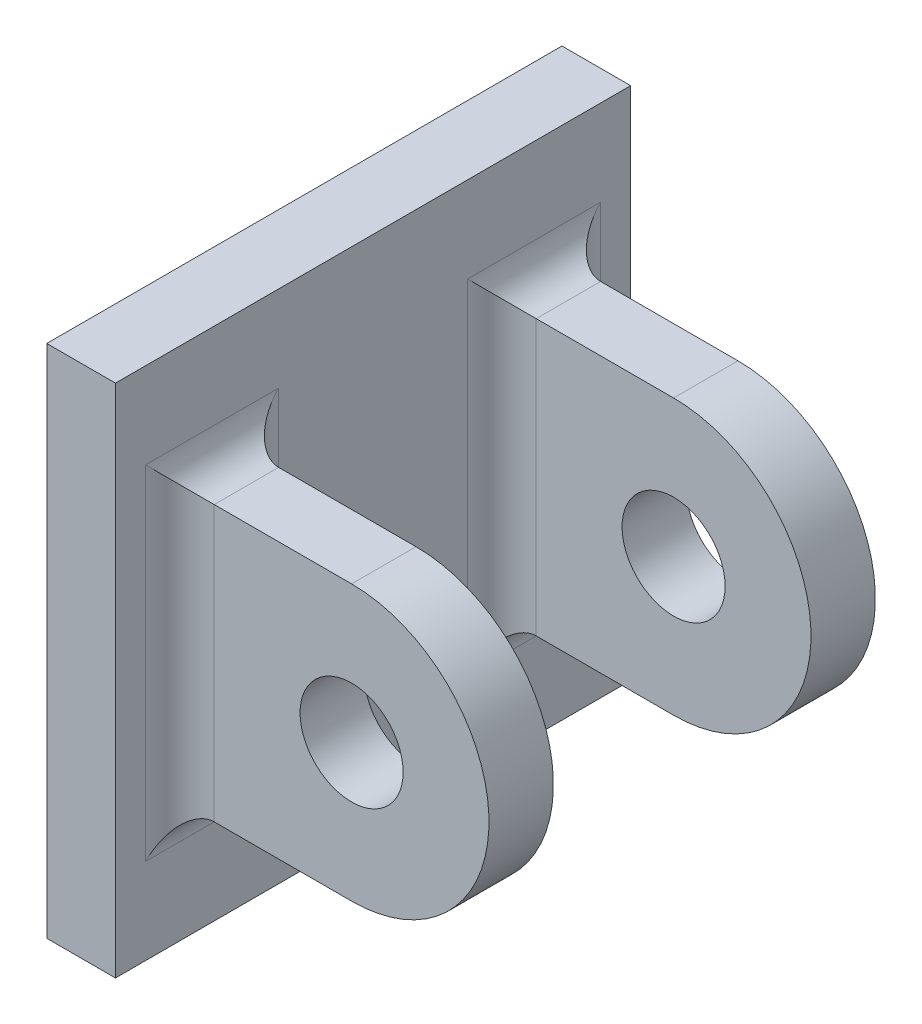
ISO-10303-21;
HEADER;
FILE_DESCRIPTION(('STEP AP214'),'2;1');
FILE_NAME('part.step','',(''),(''),'','','');
FILE_SCHEMA(('AUTOMOTIVE_DESIGN { 1 0 10303 214 1 1 1 1 }'));
ENDSEC;
DATA;
#1=APPLICATION_CONTEXT('core data for automotive mechanical design processes');
#2=APPLICATION_PROTOCOL_DEFINITION('international standard','automotive_design',2000,#1);
#3=PRODUCT_CONTEXT('',#1,'mechanical');
#4=PRODUCT('Part','Part','',(#3));
#5=PRODUCT_RELATED_PRODUCT_CATEGORY('part','',(#4));
#6=PRODUCT_DEFINITION_FORMATION('','',#4);
#7=PRODUCT_DEFINITION_CONTEXT('part definition',#1,'design');
#8=PRODUCT_DEFINITION('design','',#6,#7);
#9=PRODUCT_DEFINITION_SHAPE('','',#8);
#10=(LENGTH_UNIT() NAMED_UNIT(*) SI_UNIT(.MILLI.,.METRE.));
#11=(NAMED_UNIT(*) PLANE_ANGLE_UNIT() SI_UNIT($,.RADIAN.));
#12=(NAMED_UNIT(*) SI_UNIT($,.STERADIAN.) SOLID_ANGLE_UNIT());
#13=UNCERTAINTY_MEASURE_WITH_UNIT(LENGTH_MEASURE(1.E-05),#10,'distance_accuracy_value','');
#14=(GEOMETRIC_REPRESENTATION_CONTEXT(3) GLOBAL_UNCERTAINTY_ASSIGNED_CONTEXT((#13)) GLOBAL_UNIT_ASSIGNED_CONTEXT((#10,
#11,#12)) REPRESENTATION_CONTEXT('',''));
#15=CARTESIAN_POINT('',(0.,0.,0.));
#16=DIRECTION('',(0.,0.,1.));
#17=DIRECTION('',(1.,0.,0.));
#18=AXIS2_PLACEMENT_3D('',#15,#16,#17);
#19=CARTESIAN_POINT('',(13.97,14.605,-2.38125));
#20=DIRECTION('',(0.,0.,-1.));
#21=DIRECTION('',(-1.,0.,0.));
#22=AXIS2_PLACEMENT_3D('',#19,#20,#21);
#23=PLANE('',#22);
#24=CARTESIAN_POINT('',(8.89,9.525,-2.38125));
#25=DIRECTION('',(0.,0.,1.));
#26=DIRECTION('',(1.,0.,0.));
#27=AXIS2_PLACEMENT_3D('',#24,#25,#26);
#28=CIRCLE('',#27,1.905);
#29=CARTESIAN_POINT('',(10.795,9.525,-2.38125));
#30=VERTEX_POINT('',#29);
#31=EDGE_CURVE('E218',#30,#30,#28,.T.);
#32=ORIENTED_EDGE('',*,*,#31,.F.);
#33=EDGE_LOOP('',(#32));
#34=FACE_BOUND('',#33,.T.);
#35=DIRECTION('',(-1.,0.,0.));
#36=VECTOR('',#35,1.);
#37=CARTESIAN_POINT('',(13.97,14.605,-2.38125));
#38=LINE('',#37,#36);
#39=CARTESIAN_POINT('',(8.89,14.605,-2.38125));
#40=VERTEX_POINT('',#39);
#41=CARTESIAN_POINT('',(3.81,14.605,-2.38125));
#42=VERTEX_POINT('',#41);
#43=EDGE_CURVE('E290',#40,#42,#38,.T.);
#44=ORIENTED_EDGE('',*,*,#43,.T.);
#45=DIRECTION('',(0.,-1.,0.));
#46=VECTOR('',#45,1.);
#47=CARTESIAN_POINT('',(3.81,4.445,-2.38125));
#48=LINE('',#47,#46);
#49=CARTESIAN_POINT('',(3.81,4.445,-2.38125));
#50=VERTEX_POINT('',#49);
#51=EDGE_CURVE('E53',#42,#50,#48,.T.);
#52=ORIENTED_EDGE('',*,*,#51,.T.);
#53=DIRECTION('',(-1.,0.,0.));
#54=VECTOR('',#53,1.);
#55=CARTESIAN_POINT('',(13.97,4.445,-2.38125));
#56=LINE('',#55,#54);
#57=CARTESIAN_POINT('',(8.89,4.445,-2.38125));
#58=VERTEX_POINT('',#57);
#59=EDGE_CURVE('E169',#58,#50,#56,.T.);
#60=ORIENTED_EDGE('',*,*,#59,.F.);
#61=CARTESIAN_POINT('',(8.89,9.525,-2.38125));
#62=DIRECTION('',(0.,0.,1.));
#63=DIRECTION('',(1.,0.,0.));
#64=AXIS2_PLACEMENT_3D('',#61,#62,#63);
#65=CIRCLE('',#64,5.08);
#66=EDGE_CURVE('E159',#58,#40,#65,.T.);
#67=ORIENTED_EDGE('',*,*,#66,.T.);
#68=EDGE_LOOP('',(#44,#52,#60,#67));
#69=FACE_BOUND('',#68,.T.);
#70=ADVANCED_FACE('F44',(#34,#69),#23,.F.);
#71=CARTESIAN_POINT('',(13.97,14.605,-4.7625));
#72=DIRECTION('',(0.,0.,1.));
#73=DIRECTION('',(0.,-1.,0.));
#74=AXIS2_PLACEMENT_3D('',#71,#72,#73);
#75=PLANE('',#74);
#76=CARTESIAN_POINT('',(8.89,9.525,-4.7625));
#77=DIRECTION('',(0.,0.,1.));
#78=DIRECTION('',(0.,-1.,0.));
#79=AXIS2_PLACEMENT_3D('',#76,#77,#78);
#80=CIRCLE('',#79,1.905);
#81=CARTESIAN_POINT('',(8.89,7.62,-4.7625));
#82=VERTEX_POINT('',#81);
#83=EDGE_CURVE('E173',#82,#82,#80,.T.);
#84=ORIENTED_EDGE('',*,*,#83,.T.);
#85=EDGE_LOOP('',(#84));
#86=FACE_BOUND('',#85,.T.);
#87=DIRECTION('',(-1.,0.,0.));
#88=VECTOR('',#87,1.);
#89=CARTESIAN_POINT('',(13.97,4.445,-4.7625));
#90=LINE('',#89,#88);
#91=CARTESIAN_POINT('',(8.89,4.445,-4.7625));
#92=VERTEX_POINT('',#91);
#93=CARTESIAN_POINT('',(3.81,4.445,-4.7625));
#94=VERTEX_POINT('',#93);
#95=EDGE_CURVE('E172',#92,#94,#90,.T.);
#96=ORIENTED_EDGE('',*,*,#95,.T.);
#97=DIRECTION('',(0.,1.,0.));
#98=VECTOR('',#97,1.);
#99=CARTESIAN_POINT('',(3.81,14.605,-4.7625));
#100=LINE('',#99,#98);
#101=CARTESIAN_POINT('',(3.81,14.605,-4.7625));
#102=VERTEX_POINT('',#101);
#103=EDGE_CURVE('E245',#94,#102,#100,.T.);
#104=ORIENTED_EDGE('',*,*,#103,.T.);
#105=DIRECTION('',(-1.,0.,0.));
#106=VECTOR('',#105,1.);
#107=CARTESIAN_POINT('',(13.97,14.605,-4.7625));
#108=LINE('',#107,#106);
#109=CARTESIAN_POINT('',(8.89,14.605,-4.7625));
#110=VERTEX_POINT('',#109);
#111=EDGE_CURVE('E180',#110,#102,#108,.T.);
#112=ORIENTED_EDGE('',*,*,#111,.F.);
#113=CARTESIAN_POINT('',(8.89,9.525,-4.7625));
#114=DIRECTION('',(0.,0.,1.));
#115=DIRECTION('',(0.,-1.,0.));
#116=AXIS2_PLACEMENT_3D('',#113,#114,#115);
#117=CIRCLE('',#116,5.08);
#118=EDGE_CURVE('E305',#92,#110,#117,.T.);
#119=ORIENTED_EDGE('',*,*,#118,.F.);
#120=EDGE_LOOP('',(#96,#104,#112,#119));
#121=FACE_BOUND('',#120,.T.);
#122=ADVANCED_FACE('F288',(#86,#121),#75,.F.);
#123=CARTESIAN_POINT('',(13.97,14.605,-14.2875));
#124=DIRECTION('',(0.,0.,-1.));
#125=DIRECTION('',(0.,1.,0.));
#126=AXIS2_PLACEMENT_3D('',#123,#124,#125);
#127=PLANE('',#126);
#128=CARTESIAN_POINT('',(8.89,9.525,-14.2875));
#129=DIRECTION('',(0.,0.,-1.));
#130=DIRECTION('',(0.,1.,0.));
#131=AXIS2_PLACEMENT_3D('',#128,#129,#130);
#132=CIRCLE('',#131,1.905);
#133=CARTESIAN_POINT('',(8.89,11.43,-14.2875));
#134=VERTEX_POINT('',#133);
#135=EDGE_CURVE('E217',#134,#134,#132,.T.);
#136=ORIENTED_EDGE('',*,*,#135,.T.);
#137=EDGE_LOOP('',(#136));
#138=FACE_BOUND('',#137,.T.);
#139=DIRECTION('',(-1.,0.,0.));
#140=VECTOR('',#139,1.);
#141=CARTESIAN_POINT('',(13.97,14.605,-14.2875));
#142=LINE('',#141,#140);
#143=CARTESIAN_POINT('',(8.89,14.605,-14.2875));
#144=VERTEX_POINT('',#143);
#145=CARTESIAN_POINT('',(3.81,14.605,-14.2875));
#146=VERTEX_POINT('',#145);
#147=EDGE_CURVE('E302',#144,#146,#142,.T.);
#148=ORIENTED_EDGE('',*,*,#147,.T.);
#149=DIRECTION('',(0.,-1.,0.));
#150=VECTOR('',#149,1.);
#151=CARTESIAN_POINT('',(3.81,4.445,-14.2875));
#152=LINE('',#151,#150);
#153=CARTESIAN_POINT('',(3.81,4.445,-14.2875));
#154=VERTEX_POINT('',#153);
#155=EDGE_CURVE('E213',#146,#154,#152,.T.);
#156=ORIENTED_EDGE('',*,*,#155,.T.);
#157=DIRECTION('',(-1.,0.,0.));
#158=VECTOR('',#157,1.);
#159=CARTESIAN_POINT('',(13.97,4.445,-14.2875));
#160=LINE('',#159,#158);
#161=CARTESIAN_POINT('',(8.89,4.445,-14.2875));
#162=VERTEX_POINT('',#161);
#163=EDGE_CURVE('E291',#162,#154,#160,.T.);
#164=ORIENTED_EDGE('',*,*,#163,.F.);
#165=CARTESIAN_POINT('',(8.89,9.525,-14.2875));
#166=DIRECTION('',(0.,0.,-1.));
#167=DIRECTION('',(0.,1.,0.));
#168=AXIS2_PLACEMENT_3D('',#165,#166,#167);
#169=CIRCLE('',#168,5.08);
#170=EDGE_CURVE('E307',#144,#162,#169,.T.);
#171=ORIENTED_EDGE('',*,*,#170,.F.);
#172=EDGE_LOOP('',(#148,#156,#164,#171));
#173=FACE_BOUND('',#172,.T.);
#174=ADVANCED_FACE('F328',(#138,#173),#127,.F.);
#175=CARTESIAN_POINT('',(13.97,14.605,-16.66875));
#176=DIRECTION('',(0.,0.,1.));
#177=DIRECTION('',(1.,0.,0.));
#178=AXIS2_PLACEMENT_3D('',#175,#176,#177);
#179=PLANE('',#178);
#180=CARTESIAN_POINT('',(8.89,9.525,-16.66875));
#181=DIRECTION('',(0.,0.,1.));
#182=DIRECTION('',(1.,0.,0.));
#183=AXIS2_PLACEMENT_3D('',#180,#181,#182);
#184=CIRCLE('',#183,1.905);
#185=CARTESIAN_POINT('',(10.795,9.525,-16.66875));
#186=VERTEX_POINT('',#185);
#187=EDGE_CURVE('E214',#186,#186,#184,.T.);
#188=ORIENTED_EDGE('',*,*,#187,.T.);
#189=EDGE_LOOP('',(#188));
#190=FACE_BOUND('',#189,.T.);
#191=DIRECTION('',(-1.,0.,0.));
#192=VECTOR('',#191,1.);
#193=CARTESIAN_POINT('',(13.97,4.445,-16.66875));
#194=LINE('',#193,#192);
#195=CARTESIAN_POINT('',(8.89,4.445,-16.66875));
#196=VERTEX_POINT('',#195);
#197=CARTESIAN_POINT('',(3.81,4.445,-16.66875));
#198=VERTEX_POINT('',#197);
#199=EDGE_CURVE('E296',#196,#198,#194,.T.);
#200=ORIENTED_EDGE('',*,*,#199,.T.);
#201=DIRECTION('',(0.,1.,0.));
#202=VECTOR('',#201,1.);
#203=CARTESIAN_POINT('',(3.81,14.605,-16.66875));
#204=LINE('',#203,#202);
#205=CARTESIAN_POINT('',(3.81,14.605,-16.66875));
#206=VERTEX_POINT('',#205);
#207=EDGE_CURVE('E243',#198,#206,#204,.T.);
#208=ORIENTED_EDGE('',*,*,#207,.T.);
#209=DIRECTION('',(-1.,0.,0.));
#210=VECTOR('',#209,1.);
#211=CARTESIAN_POINT('',(13.97,14.605,-16.66875));
#212=LINE('',#211,#210);
#213=CARTESIAN_POINT('',(8.89,14.605,-16.66875));
#214=VERTEX_POINT('',#213);
#215=EDGE_CURVE('E299',#214,#206,#212,.T.);
#216=ORIENTED_EDGE('',*,*,#215,.F.);
#217=CARTESIAN_POINT('',(8.89,9.525,-16.66875));
#218=DIRECTION('',(0.,0.,1.));
#219=DIRECTION('',(1.,0.,0.));
#220=AXIS2_PLACEMENT_3D('',#217,#218,#219);
#221=CIRCLE('',#220,5.08);
#222=EDGE_CURVE('E309',#196,#214,#221,.T.);
#223=ORIENTED_EDGE('',*,*,#222,.F.);
#224=EDGE_LOOP('',(#200,#208,#216,#223));
#225=FACE_BOUND('',#224,.T.);
#226=ADVANCED_FACE('F474',(#190,#225),#179,.F.);
#227=CARTESIAN_POINT('',(13.97,14.605,-2.38125));
#228=DIRECTION('',(0.,-1.,0.));
#229=DIRECTION('',(0.,0.,-1.));
#230=AXIS2_PLACEMENT_3D('',#227,#228,#229);
#231=PLANE('',#230);
#232=ORIENTED_EDGE('',*,*,#111,.T.);
#233=DIRECTION('',(0.,0.,1.));
#234=VECTOR('',#233,1.);
#235=CARTESIAN_POINT('',(3.81,14.605,-2.38125));
#236=LINE('',#235,#234);
#237=EDGE_CURVE('E13',#102,#42,#236,.T.);
#238=ORIENTED_EDGE('',*,*,#237,.T.);
#239=ORIENTED_EDGE('',*,*,#43,.F.);
#240=DIRECTION('',(0.,0.,1.));
#241=VECTOR('',#240,1.);
#242=CARTESIAN_POINT('',(8.89,14.605,-19.05));
#243=LINE('',#242,#241);
#244=EDGE_CURVE('E165',#110,#40,#243,.T.);
#245=ORIENTED_EDGE('',*,*,#244,.F.);
#246=EDGE_LOOP('',(#232,#238,#239,#245));
#247=FACE_BOUND('',#246,.T.);
#248=ADVANCED_FACE('F289',(#247),#231,.F.);
#249=CARTESIAN_POINT('',(13.97,14.605,-14.2875));
#250=DIRECTION('',(0.,-1.,0.));
#251=DIRECTION('',(0.,0.,-1.));
#252=AXIS2_PLACEMENT_3D('',#249,#250,#251);
#253=PLANE('',#252);
#254=ORIENTED_EDGE('',*,*,#215,.T.);
#255=DIRECTION('',(0.,0.,1.));
#256=VECTOR('',#255,1.);
#257=CARTESIAN_POINT('',(3.81,14.605,-14.2875));
#258=LINE('',#257,#256);
#259=EDGE_CURVE('E239',#206,#146,#258,.T.);
#260=ORIENTED_EDGE('',*,*,#259,.T.);
#261=ORIENTED_EDGE('',*,*,#147,.F.);
#262=EDGE_CURVE('E311',#214,#144,#243,.T.);
#263=ORIENTED_EDGE('',*,*,#262,.F.);
#264=EDGE_LOOP('',(#254,#260,#261,#263));
#265=FACE_BOUND('',#264,.T.);
#266=ADVANCED_FACE('F336',(#265),#253,.F.);
#267=CARTESIAN_POINT('',(2.54,0.,0.));
#268=DIRECTION('',(-1.,0.,0.));
#269=DIRECTION('',(0.,0.,1.));
#270=AXIS2_PLACEMENT_3D('',#267,#268,#269);
#271=PLANE('',#270);
#272=DIRECTION('',(0.,0.,-1.));
#273=VECTOR('',#272,1.);
#274=CARTESIAN_POINT('',(2.54,3.175,-14.2875));
#275=LINE('',#274,#273);
#276=CARTESIAN_POINT('',(2.54,3.175,-17.93875));
#277=VERTEX_POINT('',#276);
#278=CARTESIAN_POINT('',(2.54,3.175,-13.0175));
#279=VERTEX_POINT('',#278);
#280=EDGE_CURVE('E232',#277,#279,#275,.F.);
#281=ORIENTED_EDGE('',*,*,#280,.T.);
#282=DIRECTION('',(0.,-1.,0.));
#283=VECTOR('',#282,1.);
#284=CARTESIAN_POINT('',(2.54,14.605,-13.0175));
#285=LINE('',#284,#283);
#286=CARTESIAN_POINT('',(2.54,15.875,-13.0175));
#287=VERTEX_POINT('',#286);
#288=EDGE_CURVE('E236',#279,#287,#285,.F.);
#289=ORIENTED_EDGE('',*,*,#288,.T.);
#290=DIRECTION('',(0.,0.,1.));
#291=VECTOR('',#290,1.);
#292=CARTESIAN_POINT('',(2.54,15.875,-16.66875));
#293=LINE('',#292,#291);
#294=CARTESIAN_POINT('',(2.54,15.875,-17.93875));
#295=VERTEX_POINT('',#294);
#296=EDGE_CURVE('E234',#287,#295,#293,.F.);
#297=ORIENTED_EDGE('',*,*,#296,.T.);
#298=DIRECTION('',(0.,1.,0.));
#299=VECTOR('',#298,1.);
#300=CARTESIAN_POINT('',(2.54,4.445,-17.93875));
#301=LINE('',#300,#299);
#302=EDGE_CURVE('E230',#295,#277,#301,.F.);
#303=ORIENTED_EDGE('',*,*,#302,.T.);
#304=EDGE_LOOP('',(#281,#289,#297,#303));
#305=FACE_BOUND('',#304,.T.);
#306=DIRECTION('',(0.,0.,1.));
#307=VECTOR('',#306,1.);
#308=CARTESIAN_POINT('',(2.54,15.875,-4.7625));
#309=LINE('',#308,#307);
#310=CARTESIAN_POINT('',(2.54,15.875,-1.11125));
#311=VERTEX_POINT('',#310);
#312=CARTESIAN_POINT('',(2.54,15.875,-6.0325));
#313=VERTEX_POINT('',#312);
#314=EDGE_CURVE('E221',#311,#313,#309,.F.);
#315=ORIENTED_EDGE('',*,*,#314,.T.);
#316=DIRECTION('',(0.,1.,0.));
#317=VECTOR('',#316,1.);
#318=CARTESIAN_POINT('',(2.54,4.445,-6.0325));
#319=LINE('',#318,#317);
#320=CARTESIAN_POINT('',(2.54,3.175,-6.0325));
#321=VERTEX_POINT('',#320);
#322=EDGE_CURVE('E227',#313,#321,#319,.F.);
#323=ORIENTED_EDGE('',*,*,#322,.T.);
#324=DIRECTION('',(0.,0.,-1.));
#325=VECTOR('',#324,1.);
#326=CARTESIAN_POINT('',(2.54,3.175,-2.38125));
#327=LINE('',#326,#325);
#328=CARTESIAN_POINT('',(2.54,3.175,-1.11125));
#329=VERTEX_POINT('',#328);
#330=EDGE_CURVE('E225',#321,#329,#327,.F.);
#331=ORIENTED_EDGE('',*,*,#330,.T.);
#332=DIRECTION('',(0.,-1.,0.));
#333=VECTOR('',#332,1.);
#334=CARTESIAN_POINT('',(2.54,14.605,-1.11125));
#335=LINE('',#334,#333);
#336=EDGE_CURVE('E223',#329,#311,#335,.F.);
#337=ORIENTED_EDGE('',*,*,#336,.T.);
#338=EDGE_LOOP('',(#315,#323,#331,#337));
#339=FACE_BOUND('',#338,.T.);
#340=DIRECTION('',(0.,-1.,0.));
#341=VECTOR('',#340,1.);
#342=CARTESIAN_POINT('',(2.54,0.,0.));
#343=LINE('',#342,#341);
#344=CARTESIAN_POINT('',(2.54,19.05,0.));
#345=VERTEX_POINT('',#344);
#346=CARTESIAN_POINT('',(2.54,0.,0.));
#347=VERTEX_POINT('',#346);
#348=EDGE_CURVE('E184',#345,#347,#343,.T.);
#349=ORIENTED_EDGE('',*,*,#348,.T.);
#350=DIRECTION('',(0.,0.,-1.));
#351=VECTOR('',#350,1.);
#352=CARTESIAN_POINT('',(2.54,0.,0.));
#353=LINE('',#352,#351);
#354=CARTESIAN_POINT('',(2.54,0.,-19.05));
#355=VERTEX_POINT('',#354);
#356=EDGE_CURVE('E187',#347,#355,#353,.T.);
#357=ORIENTED_EDGE('',*,*,#356,.T.);
#358=DIRECTION('',(0.,1.,0.));
#359=VECTOR('',#358,1.);
#360=CARTESIAN_POINT('',(2.54,0.,-19.05));
#361=LINE('',#360,#359);
#362=CARTESIAN_POINT('',(2.54,19.05,-19.05));
#363=VERTEX_POINT('',#362);
#364=EDGE_CURVE('E190',#355,#363,#361,.T.);
#365=ORIENTED_EDGE('',*,*,#364,.T.);
#366=DIRECTION('',(0.,0.,1.));
#367=VECTOR('',#366,1.);
#368=CARTESIAN_POINT('',(2.54,19.05,0.));
#369=LINE('',#368,#367);
#370=EDGE_CURVE('E192',#363,#345,#369,.T.);
#371=ORIENTED_EDGE('',*,*,#370,.T.);
#372=EDGE_LOOP('',(#349,#357,#365,#371));
#373=FACE_BOUND('',#372,.T.);
#374=ADVANCED_FACE('F278',(#305,#339,#373),#271,.F.);
#375=CARTESIAN_POINT('',(2.54,0.,0.));
#376=DIRECTION('',(0.,0.,-1.));
#377=DIRECTION('',(-1.,0.,0.));
#378=AXIS2_PLACEMENT_3D('',#375,#376,#377);
#379=PLANE('',#378);
#380=DIRECTION('',(0.,-1.,0.));
#381=VECTOR('',#380,1.);
#382=CARTESIAN_POINT('',(0.,0.,0.));
#383=LINE('',#382,#381);
#384=CARTESIAN_POINT('',(0.,19.05,0.));
#385=VERTEX_POINT('',#384);
#386=CARTESIAN_POINT('',(0.,0.,0.));
#387=VERTEX_POINT('',#386);
#388=EDGE_CURVE('E175',#385,#387,#383,.T.);
#389=ORIENTED_EDGE('',*,*,#388,.T.);
#390=DIRECTION('',(-1.,0.,0.));
#391=VECTOR('',#390,1.);
#392=CARTESIAN_POINT('',(2.54,0.,0.));
#393=LINE('',#392,#391);
#394=EDGE_CURVE('E207',#347,#387,#393,.T.);
#395=ORIENTED_EDGE('',*,*,#394,.F.);
#396=ORIENTED_EDGE('',*,*,#348,.F.);
#397=DIRECTION('',(-1.,0.,0.));
#398=VECTOR('',#397,1.);
#399=CARTESIAN_POINT('',(2.54,19.05,0.));
#400=LINE('',#399,#398);
#401=EDGE_CURVE('E193',#345,#385,#400,.T.);
#402=ORIENTED_EDGE('',*,*,#401,.T.);
#403=EDGE_LOOP('',(#389,#395,#396,#402));
#404=FACE_BOUND('',#403,.T.);
#405=ADVANCED_FACE('F335',(#404),#379,.F.);
#406=CARTESIAN_POINT('',(2.54,0.,0.));
#407=DIRECTION('',(0.,1.,0.));
#408=DIRECTION('',(0.,0.,1.));
#409=AXIS2_PLACEMENT_3D('',#406,#407,#408);
#410=PLANE('',#409);
#411=DIRECTION('',(0.,0.,-1.));
#412=VECTOR('',#411,1.);
#413=CARTESIAN_POINT('',(0.,0.,0.));
#414=LINE('',#413,#412);
#415=CARTESIAN_POINT('',(0.,0.,-19.05));
#416=VERTEX_POINT('',#415);
#417=EDGE_CURVE('E178',#387,#416,#414,.T.);
#418=ORIENTED_EDGE('',*,*,#417,.T.);
#419=DIRECTION('',(-1.,0.,0.));
#420=VECTOR('',#419,1.);
#421=CARTESIAN_POINT('',(2.54,0.,-19.05));
#422=LINE('',#421,#420);
#423=EDGE_CURVE('E204',#355,#416,#422,.T.);
#424=ORIENTED_EDGE('',*,*,#423,.F.);
#425=ORIENTED_EDGE('',*,*,#356,.F.);
#426=ORIENTED_EDGE('',*,*,#394,.T.);
#427=EDGE_LOOP('',(#418,#424,#425,#426));
#428=FACE_BOUND('',#427,.T.);
#429=ADVANCED_FACE('F349',(#428),#410,.F.);
#430=CARTESIAN_POINT('',(2.54,0.,-19.05));
#431=DIRECTION('',(0.,0.,1.));
#432=DIRECTION('',(1.,0.,0.));
#433=AXIS2_PLACEMENT_3D('',#430,#431,#432);
#434=PLANE('',#433);
#435=DIRECTION('',(0.,1.,0.));
#436=VECTOR('',#435,1.);
#437=CARTESIAN_POINT('',(0.,0.,-19.05));
#438=LINE('',#437,#436);
#439=CARTESIAN_POINT('',(0.,19.05,-19.05));
#440=VERTEX_POINT('',#439);
#441=EDGE_CURVE('E196',#416,#440,#438,.T.);
#442=ORIENTED_EDGE('',*,*,#441,.T.);
#443=DIRECTION('',(-1.,0.,0.));
#444=VECTOR('',#443,1.);
#445=CARTESIAN_POINT('',(2.54,19.05,-19.05));
#446=LINE('',#445,#444);
#447=EDGE_CURVE('E201',#363,#440,#446,.T.);
#448=ORIENTED_EDGE('',*,*,#447,.F.);
#449=ORIENTED_EDGE('',*,*,#364,.F.);
#450=ORIENTED_EDGE('',*,*,#423,.T.);
#451=EDGE_LOOP('',(#442,#448,#449,#450));
#452=FACE_BOUND('',#451,.T.);
#453=ADVANCED_FACE('F345',(#452),#434,.F.);
#454=CARTESIAN_POINT('',(2.54,19.05,0.));
#455=DIRECTION('',(0.,-1.,0.));
#456=DIRECTION('',(0.,0.,-1.));
#457=AXIS2_PLACEMENT_3D('',#454,#455,#456);
#458=PLANE('',#457);
#459=DIRECTION('',(0.,0.,1.));
#460=VECTOR('',#459,1.);
#461=CARTESIAN_POINT('',(0.,19.05,0.));
#462=LINE('',#461,#460);
#463=EDGE_CURVE('E188',#440,#385,#462,.T.);
#464=ORIENTED_EDGE('',*,*,#463,.T.);
#465=ORIENTED_EDGE('',*,*,#401,.F.);
#466=ORIENTED_EDGE('',*,*,#370,.F.);
#467=ORIENTED_EDGE('',*,*,#447,.T.);
#468=EDGE_LOOP('',(#464,#465,#466,#467));
#469=FACE_BOUND('',#468,.T.);
#470=ADVANCED_FACE('F341',(#469),#458,.F.);
#471=CARTESIAN_POINT('',(0.,0.,0.));
#472=DIRECTION('',(-1.,0.,0.));
#473=DIRECTION('',(0.,0.,1.));
#474=AXIS2_PLACEMENT_3D('',#471,#472,#473);
#475=PLANE('',#474);
#476=ORIENTED_EDGE('',*,*,#388,.F.);
#477=ORIENTED_EDGE('',*,*,#463,.F.);
#478=ORIENTED_EDGE('',*,*,#441,.F.);
#479=ORIENTED_EDGE('',*,*,#417,.F.);
#480=EDGE_LOOP('',(#476,#477,#478,#479));
#481=FACE_BOUND('',#480,.T.);
#482=ADVANCED_FACE('F338',(#481),#475,.T.);
#483=CARTESIAN_POINT('',(13.97,4.445,-2.38125));
#484=DIRECTION('',(0.,1.,0.));
#485=DIRECTION('',(0.,0.,1.));
#486=AXIS2_PLACEMENT_3D('',#483,#484,#485);
#487=PLANE('',#486);
#488=ORIENTED_EDGE('',*,*,#59,.T.);
#489=DIRECTION('',(0.,0.,-1.));
#490=VECTOR('',#489,1.);
#491=CARTESIAN_POINT('',(3.81,4.445,-4.7625));
#492=LINE('',#491,#490);
#493=EDGE_CURVE('E248',#50,#94,#492,.T.);
#494=ORIENTED_EDGE('',*,*,#493,.T.);
#495=ORIENTED_EDGE('',*,*,#95,.F.);
#496=DIRECTION('',(0.,0.,1.));
#497=VECTOR('',#496,1.);
#498=CARTESIAN_POINT('',(8.89,4.445,-19.05));
#499=LINE('',#498,#497);
#500=EDGE_CURVE('E162',#92,#58,#499,.T.);
#501=ORIENTED_EDGE('',*,*,#500,.T.);
#502=EDGE_LOOP('',(#488,#494,#495,#501));
#503=FACE_BOUND('',#502,.T.);
#504=ADVANCED_FACE('F168',(#503),#487,.F.);
#505=CARTESIAN_POINT('',(13.97,4.445,-14.2875));
#506=DIRECTION('',(0.,1.,0.));
#507=DIRECTION('',(0.,0.,1.));
#508=AXIS2_PLACEMENT_3D('',#505,#506,#507);
#509=PLANE('',#508);
#510=ORIENTED_EDGE('',*,*,#163,.T.);
#511=DIRECTION('',(0.,0.,-1.));
#512=VECTOR('',#511,1.);
#513=CARTESIAN_POINT('',(3.81,4.445,-16.66875));
#514=LINE('',#513,#512);
#515=EDGE_CURVE('E241',#154,#198,#514,.T.);
#516=ORIENTED_EDGE('',*,*,#515,.T.);
#517=ORIENTED_EDGE('',*,*,#199,.F.);
#518=DIRECTION('',(0.,0.,1.));
#519=VECTOR('',#518,1.);
#520=CARTESIAN_POINT('',(8.89,4.445,-19.05));
#521=LINE('',#520,#519);
#522=EDGE_CURVE('E210',#196,#162,#521,.T.);
#523=ORIENTED_EDGE('',*,*,#522,.T.);
#524=EDGE_LOOP('',(#510,#516,#517,#523));
#525=FACE_BOUND('',#524,.T.);
#526=ADVANCED_FACE('F425',(#525),#509,.F.);
#527=CARTESIAN_POINT('',(8.89,9.525,-19.05));
#528=DIRECTION('',(0.,0.,1.));
#529=DIRECTION('',(1.,0.,0.));
#530=AXIS2_PLACEMENT_3D('',#527,#528,#529);
#531=CYLINDRICAL_SURFACE('',#530,5.08);
#532=ORIENTED_EDGE('',*,*,#170,.T.);
#533=ORIENTED_EDGE('',*,*,#522,.F.);
#534=ORIENTED_EDGE('',*,*,#222,.T.);
#535=ORIENTED_EDGE('',*,*,#262,.T.);
#536=EDGE_LOOP('',(#532,#533,#534,#535));
#537=FACE_BOUND('',#536,.T.);
#538=ADVANCED_FACE('F418',(#537),#531,.T.);
#539=ORIENTED_EDGE('',*,*,#118,.T.);
#540=ORIENTED_EDGE('',*,*,#244,.T.);
#541=ORIENTED_EDGE('',*,*,#66,.F.);
#542=ORIENTED_EDGE('',*,*,#500,.F.);
#543=EDGE_LOOP('',(#539,#540,#541,#542));
#544=FACE_BOUND('',#543,.T.);
#545=ADVANCED_FACE('F161',(#544),#531,.T.);
#546=CARTESIAN_POINT('',(8.89,9.525,-19.05));
#547=DIRECTION('',(0.,0.,1.));
#548=DIRECTION('',(1.,0.,0.));
#549=AXIS2_PLACEMENT_3D('',#546,#547,#548);
#550=CYLINDRICAL_SURFACE('',#549,1.905);
#551=ORIENTED_EDGE('',*,*,#187,.F.);
#552=EDGE_LOOP('',(#551));
#553=FACE_BOUND('',#552,.T.);
#554=ORIENTED_EDGE('',*,*,#135,.F.);
#555=EDGE_LOOP('',(#554));
#556=FACE_BOUND('',#555,.T.);
#557=ADVANCED_FACE('F405',(#553,#556),#550,.F.);
#558=ORIENTED_EDGE('',*,*,#31,.T.);
#559=EDGE_LOOP('',(#558));
#560=FACE_BOUND('',#559,.T.);
#561=ORIENTED_EDGE('',*,*,#83,.F.);
#562=EDGE_LOOP('',(#561));
#563=FACE_BOUND('',#562,.T.);
#564=ADVANCED_FACE('F320',(#560,#563),#550,.F.);
#565=CARTESIAN_POINT('',(3.81,14.605,-17.93875));
#566=DIRECTION('',(0.,-1.,0.));
#567=DIRECTION('',(0.,0.,-1.));
#568=AXIS2_PLACEMENT_3D('',#565,#566,#567);
#569=CYLINDRICAL_SURFACE('',#568,1.27);
#570=CARTESIAN_POINT('',(3.81,3.175,-17.93875));
#571=DIRECTION('',(0.,-0.707106781186547,0.707106781186547));
#572=DIRECTION('',(0.,-0.707106781186547,-0.707106781186547));
#573=AXIS2_PLACEMENT_3D('',#570,#571,#572);
#574=ELLIPSE('',#573,1.79605122421383,1.27);
#575=EDGE_CURVE('E255',#277,#198,#574,.F.);
#576=ORIENTED_EDGE('',*,*,#575,.F.);
#577=ORIENTED_EDGE('',*,*,#302,.F.);
#578=CARTESIAN_POINT('',(3.81,15.875,-17.93875));
#579=DIRECTION('',(0.,-0.707106781186547,-0.707106781186547));
#580=DIRECTION('',(0.,-0.707106781186547,0.707106781186547));
#581=AXIS2_PLACEMENT_3D('',#578,#579,#580);
#582=ELLIPSE('',#581,1.79605122421383,1.27);
#583=EDGE_CURVE('E258',#206,#295,#582,.T.);
#584=ORIENTED_EDGE('',*,*,#583,.F.);
#585=ORIENTED_EDGE('',*,*,#207,.F.);
#586=EDGE_LOOP('',(#576,#577,#584,#585));
#587=FACE_BOUND('',#586,.T.);
#588=ADVANCED_FACE('F368',(#587),#569,.F.);
#589=CARTESIAN_POINT('',(3.81,15.875,-14.2875));
#590=DIRECTION('',(0.,0.,-1.));
#591=DIRECTION('',(-1.,0.,0.));
#592=AXIS2_PLACEMENT_3D('',#589,#590,#591);
#593=CYLINDRICAL_SURFACE('',#592,1.27);
#594=ORIENTED_EDGE('',*,*,#583,.T.);
#595=ORIENTED_EDGE('',*,*,#296,.F.);
#596=CARTESIAN_POINT('',(3.81,15.875,-13.0175));
#597=DIRECTION('',(0.,0.707106781186548,-0.707106781186547));
#598=DIRECTION('',(0.,-0.707106781186547,-0.707106781186548));
#599=AXIS2_PLACEMENT_3D('',#596,#597,#598);
#600=ELLIPSE('',#599,1.79605122421383,1.27);
#601=EDGE_CURVE('E253',#146,#287,#600,.T.);
#602=ORIENTED_EDGE('',*,*,#601,.F.);
#603=ORIENTED_EDGE('',*,*,#259,.F.);
#604=EDGE_LOOP('',(#594,#595,#602,#603));
#605=FACE_BOUND('',#604,.T.);
#606=ADVANCED_FACE('F364',(#605),#593,.F.);
#607=CARTESIAN_POINT('',(3.81,3.175,-14.2875));
#608=DIRECTION('',(0.,0.,1.));
#609=DIRECTION('',(1.,0.,0.));
#610=AXIS2_PLACEMENT_3D('',#607,#608,#609);
#611=CYLINDRICAL_SURFACE('',#610,1.27);
#612=ORIENTED_EDGE('',*,*,#575,.T.);
#613=ORIENTED_EDGE('',*,*,#515,.F.);
#614=CARTESIAN_POINT('',(3.81,3.175,-13.0175));
#615=DIRECTION('',(0.,0.707106781186547,0.707106781186548));
#616=DIRECTION('',(0.,-0.707106781186548,0.707106781186547));
#617=AXIS2_PLACEMENT_3D('',#614,#615,#616);
#618=ELLIPSE('',#617,1.79605122421383,1.27);
#619=EDGE_CURVE('E251',#279,#154,#618,.F.);
#620=ORIENTED_EDGE('',*,*,#619,.F.);
#621=ORIENTED_EDGE('',*,*,#280,.F.);
#622=EDGE_LOOP('',(#612,#613,#620,#621));
#623=FACE_BOUND('',#622,.T.);
#624=ADVANCED_FACE('F360',(#623),#611,.F.);
#625=CARTESIAN_POINT('',(3.81,14.605,-13.0175));
#626=DIRECTION('',(0.,1.,0.));
#627=DIRECTION('',(0.,0.,1.));
#628=AXIS2_PLACEMENT_3D('',#625,#626,#627);
#629=CYLINDRICAL_SURFACE('',#628,1.27);
#630=ORIENTED_EDGE('',*,*,#601,.T.);
#631=ORIENTED_EDGE('',*,*,#288,.F.);
#632=ORIENTED_EDGE('',*,*,#619,.T.);
#633=ORIENTED_EDGE('',*,*,#155,.F.);
#634=EDGE_LOOP('',(#630,#631,#632,#633));
#635=FACE_BOUND('',#634,.T.);
#636=ADVANCED_FACE('F357',(#635),#629,.F.);
#637=CARTESIAN_POINT('',(3.81,14.605,-1.11125));
#638=DIRECTION('',(0.,1.,0.));
#639=DIRECTION('',(0.,0.,1.));
#640=AXIS2_PLACEMENT_3D('',#637,#638,#639);
#641=CYLINDRICAL_SURFACE('',#640,1.27);
#642=CARTESIAN_POINT('',(3.81,15.875,-1.11125));
#643=DIRECTION('',(0.,0.707106781186547,-0.707106781186547));
#644=DIRECTION('',(0.,-0.707106781186547,-0.707106781186547));
#645=AXIS2_PLACEMENT_3D('',#642,#643,#644);
#646=ELLIPSE('',#645,1.79605122421383,1.27);
#647=EDGE_CURVE('E264',#311,#42,#646,.F.);
#648=ORIENTED_EDGE('',*,*,#647,.F.);
#649=ORIENTED_EDGE('',*,*,#336,.F.);
#650=CARTESIAN_POINT('',(3.81,3.175,-1.11125));
#651=DIRECTION('',(0.,0.707106781186547,0.707106781186547));
#652=DIRECTION('',(0.,0.707106781186547,-0.707106781186547));
#653=AXIS2_PLACEMENT_3D('',#650,#651,#652);
#654=ELLIPSE('',#653,1.79605122421383,1.27);
#655=EDGE_CURVE('E48',#50,#329,#654,.T.);
#656=ORIENTED_EDGE('',*,*,#655,.F.);
#657=ORIENTED_EDGE('',*,*,#51,.F.);
#658=EDGE_LOOP('',(#648,#649,#656,#657));
#659=FACE_BOUND('',#658,.T.);
#660=ADVANCED_FACE('F46',(#659),#641,.F.);
#661=CARTESIAN_POINT('',(3.81,3.175,-2.38125));
#662=DIRECTION('',(0.,0.,1.));
#663=DIRECTION('',(1.,0.,0.));
#664=AXIS2_PLACEMENT_3D('',#661,#662,#663);
#665=CYLINDRICAL_SURFACE('',#664,1.27);
#666=ORIENTED_EDGE('',*,*,#655,.T.);
#667=ORIENTED_EDGE('',*,*,#330,.F.);
#668=CARTESIAN_POINT('',(3.81,3.175,-6.0325));
#669=DIRECTION('',(0.,-0.707106781186547,0.707106781186548));
#670=DIRECTION('',(0.,0.707106781186548,0.707106781186547));
#671=AXIS2_PLACEMENT_3D('',#668,#669,#670);
#672=ELLIPSE('',#671,1.79605122421383,1.27);
#673=EDGE_CURVE('E263',#94,#321,#672,.T.);
#674=ORIENTED_EDGE('',*,*,#673,.F.);
#675=ORIENTED_EDGE('',*,*,#493,.F.);
#676=EDGE_LOOP('',(#666,#667,#674,#675));
#677=FACE_BOUND('',#676,.T.);
#678=ADVANCED_FACE('F273',(#677),#665,.F.);
#679=CARTESIAN_POINT('',(3.81,15.875,-2.38125));
#680=DIRECTION('',(0.,0.,-1.));
#681=DIRECTION('',(-1.,0.,0.));
#682=AXIS2_PLACEMENT_3D('',#679,#680,#681);
#683=CYLINDRICAL_SURFACE('',#682,1.27);
#684=ORIENTED_EDGE('',*,*,#647,.T.);
#685=ORIENTED_EDGE('',*,*,#237,.F.);
#686=CARTESIAN_POINT('',(3.81,15.875,-6.0325));
#687=DIRECTION('',(0.,-0.707106781186548,-0.707106781186547));
#688=DIRECTION('',(0.,0.707106781186547,-0.707106781186548));
#689=AXIS2_PLACEMENT_3D('',#686,#687,#688);
#690=ELLIPSE('',#689,1.79605122421383,1.27);
#691=EDGE_CURVE('E261',#313,#102,#690,.F.);
#692=ORIENTED_EDGE('',*,*,#691,.F.);
#693=ORIENTED_EDGE('',*,*,#314,.F.);
#694=EDGE_LOOP('',(#684,#685,#692,#693));
#695=FACE_BOUND('',#694,.T.);
#696=ADVANCED_FACE('F285',(#695),#683,.F.);
#697=CARTESIAN_POINT('',(3.81,14.605,-6.0325));
#698=DIRECTION('',(0.,-1.,0.));
#699=DIRECTION('',(0.,0.,-1.));
#700=AXIS2_PLACEMENT_3D('',#697,#698,#699);
#701=CYLINDRICAL_SURFACE('',#700,1.27);
#702=ORIENTED_EDGE('',*,*,#673,.T.);
#703=ORIENTED_EDGE('',*,*,#322,.F.);
#704=ORIENTED_EDGE('',*,*,#691,.T.);
#705=ORIENTED_EDGE('',*,*,#103,.F.);
#706=EDGE_LOOP('',(#702,#703,#704,#705));
#707=FACE_BOUND('',#706,.T.);
#708=ADVANCED_FACE('F283',(#707),#701,.F.);
#709=CLOSED_SHELL('',(#70,#122,#174,#226,#248,#266,#374,#405,#429,#453,#470,#482,#504,#526,#538,
#545,#557,#564,#588,#606,#624,#636,#660,#678,#696,#708));
#710=MANIFOLD_SOLID_BREP('B2',#709);
#711=ADVANCED_BREP_SHAPE_REPRESENTATION('',(#18,#710),#14);
#712=SHAPE_DEFINITION_REPRESENTATION(#9,#711);
ENDSEC;
END-ISO-10303-21;
